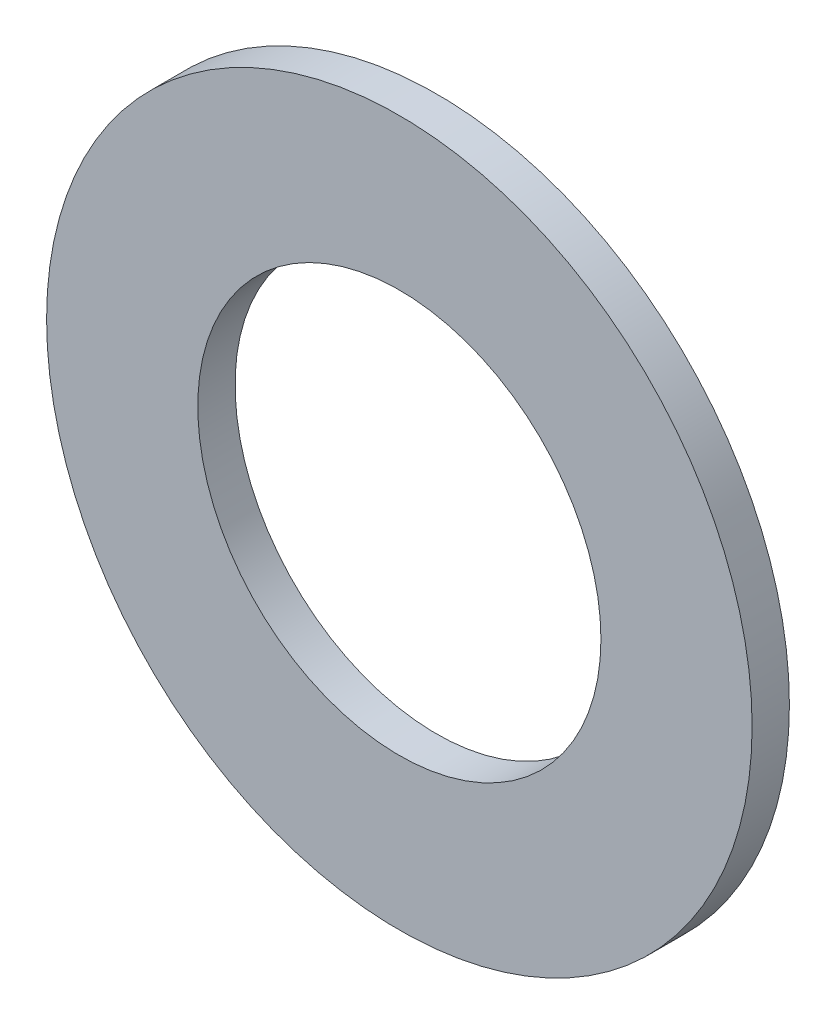
ISO-10303-21;
HEADER;
FILE_DESCRIPTION(('STEP AP214'),'2;1');
FILE_NAME('part.step','',(''),(''),'','','');
FILE_SCHEMA(('AUTOMOTIVE_DESIGN { 1 0 10303 214 1 1 1 1 }'));
ENDSEC;
DATA;
#1=APPLICATION_CONTEXT('core data for automotive mechanical design processes');
#2=APPLICATION_PROTOCOL_DEFINITION('international standard','automotive_design',2000,#1);
#3=PRODUCT_CONTEXT('',#1,'mechanical');
#4=PRODUCT('Part','Part','',(#3));
#5=PRODUCT_RELATED_PRODUCT_CATEGORY('part','',(#4));
#6=PRODUCT_DEFINITION_FORMATION('','',#4);
#7=PRODUCT_DEFINITION_CONTEXT('part definition',#1,'design');
#8=PRODUCT_DEFINITION('design','',#6,#7);
#9=PRODUCT_DEFINITION_SHAPE('','',#8);
#10=(LENGTH_UNIT() NAMED_UNIT(*) SI_UNIT(.MILLI.,.METRE.));
#11=(NAMED_UNIT(*) PLANE_ANGLE_UNIT() SI_UNIT($,.RADIAN.));
#12=(NAMED_UNIT(*) SI_UNIT($,.STERADIAN.) SOLID_ANGLE_UNIT());
#13=UNCERTAINTY_MEASURE_WITH_UNIT(LENGTH_MEASURE(1.E-05),#10,'distance_accuracy_value','');
#14=(GEOMETRIC_REPRESENTATION_CONTEXT(3) GLOBAL_UNCERTAINTY_ASSIGNED_CONTEXT((#13)) GLOBAL_UNIT_ASSIGNED_CONTEXT((#10,
#11,#12)) REPRESENTATION_CONTEXT('',''));
#15=CARTESIAN_POINT('',(0.,0.,0.));
#16=DIRECTION('',(0.,0.,1.));
#17=DIRECTION('',(1.,0.,0.));
#18=AXIS2_PLACEMENT_3D('',#15,#16,#17);
#19=CARTESIAN_POINT('',(0.,0.,1.85));
#20=DIRECTION('',(0.,0.,1.));
#21=DIRECTION('',(1.,0.,0.));
#22=AXIS2_PLACEMENT_3D('',#19,#20,#21);
#23=PLANE('',#22);
#24=CARTESIAN_POINT('',(0.,0.,1.85));
#25=DIRECTION('',(0.,0.,1.));
#26=DIRECTION('',(1.,0.,0.));
#27=AXIS2_PLACEMENT_3D('',#24,#25,#26);
#28=CIRCLE('',#27,17.5);
#29=CARTESIAN_POINT('',(17.5,0.,1.85));
#30=VERTEX_POINT('',#29);
#31=EDGE_CURVE('E10',#30,#30,#28,.T.);
#32=ORIENTED_EDGE('',*,*,#31,.T.);
#33=EDGE_LOOP('',(#32));
#34=FACE_BOUND('',#33,.T.);
#35=CARTESIAN_POINT('',(0.,0.,1.85));
#36=DIRECTION('',(0.,0.,1.));
#37=DIRECTION('',(1.,0.,0.));
#38=AXIS2_PLACEMENT_3D('',#35,#36,#37);
#39=CIRCLE('',#38,10.);
#40=CARTESIAN_POINT('',(10.,0.,1.85));
#41=VERTEX_POINT('',#40);
#42=EDGE_CURVE('E50',#41,#41,#39,.T.);
#43=ORIENTED_EDGE('',*,*,#42,.F.);
#44=EDGE_LOOP('',(#43));
#45=FACE_BOUND('',#44,.T.);
#46=ADVANCED_FACE('F39',(#34,#45),#23,.T.);
#47=CARTESIAN_POINT('',(0.,0.,0.));
#48=DIRECTION('',(0.,0.,1.));
#49=DIRECTION('',(1.,0.,0.));
#50=AXIS2_PLACEMENT_3D('',#47,#48,#49);
#51=PLANE('',#50);
#52=CARTESIAN_POINT('',(0.,0.,0.));
#53=DIRECTION('',(0.,0.,1.));
#54=DIRECTION('',(1.,0.,0.));
#55=AXIS2_PLACEMENT_3D('',#52,#53,#54);
#56=CIRCLE('',#55,17.5);
#57=CARTESIAN_POINT('',(17.5,0.,0.));
#58=VERTEX_POINT('',#57);
#59=EDGE_CURVE('E43',#58,#58,#56,.T.);
#60=ORIENTED_EDGE('',*,*,#59,.F.);
#61=EDGE_LOOP('',(#60));
#62=FACE_BOUND('',#61,.T.);
#63=CARTESIAN_POINT('',(0.,0.,0.));
#64=DIRECTION('',(0.,0.,1.));
#65=DIRECTION('',(1.,0.,0.));
#66=AXIS2_PLACEMENT_3D('',#63,#64,#65);
#67=CIRCLE('',#66,10.);
#68=CARTESIAN_POINT('',(10.,0.,0.));
#69=VERTEX_POINT('',#68);
#70=EDGE_CURVE('E52',#69,#69,#67,.T.);
#71=ORIENTED_EDGE('',*,*,#70,.T.);
#72=EDGE_LOOP('',(#71));
#73=FACE_BOUND('',#72,.T.);
#74=ADVANCED_FACE('F62',(#62,#73),#51,.F.);
#75=CARTESIAN_POINT('',(0.,0.,1.85));
#76=DIRECTION('',(0.,0.,-1.));
#77=DIRECTION('',(-1.,0.,0.));
#78=AXIS2_PLACEMENT_3D('',#75,#76,#77);
#79=CYLINDRICAL_SURFACE('',#78,17.5);
#80=ORIENTED_EDGE('',*,*,#31,.F.);
#81=EDGE_LOOP('',(#80));
#82=FACE_BOUND('',#81,.T.);
#83=ORIENTED_EDGE('',*,*,#59,.T.);
#84=EDGE_LOOP('',(#83));
#85=FACE_BOUND('',#84,.T.);
#86=ADVANCED_FACE('F41',(#82,#85),#79,.T.);
#87=CARTESIAN_POINT('',(0.,0.,1.85));
#88=DIRECTION('',(0.,0.,-1.));
#89=DIRECTION('',(-1.,0.,0.));
#90=AXIS2_PLACEMENT_3D('',#87,#88,#89);
#91=CYLINDRICAL_SURFACE('',#90,10.);
#92=ORIENTED_EDGE('',*,*,#42,.T.);
#93=EDGE_LOOP('',(#92));
#94=FACE_BOUND('',#93,.T.);
#95=ORIENTED_EDGE('',*,*,#70,.F.);
#96=EDGE_LOOP('',(#95));
#97=FACE_BOUND('',#96,.T.);
#98=ADVANCED_FACE('F58',(#94,#97),#91,.F.);
#99=CLOSED_SHELL('',(#46,#74,#86,#98));
#100=MANIFOLD_SOLID_BREP('B2',#99);
#101=ADVANCED_BREP_SHAPE_REPRESENTATION('',(#18,#100),#14);
#102=SHAPE_DEFINITION_REPRESENTATION(#9,#101);
ENDSEC;
END-ISO-10303-21;
